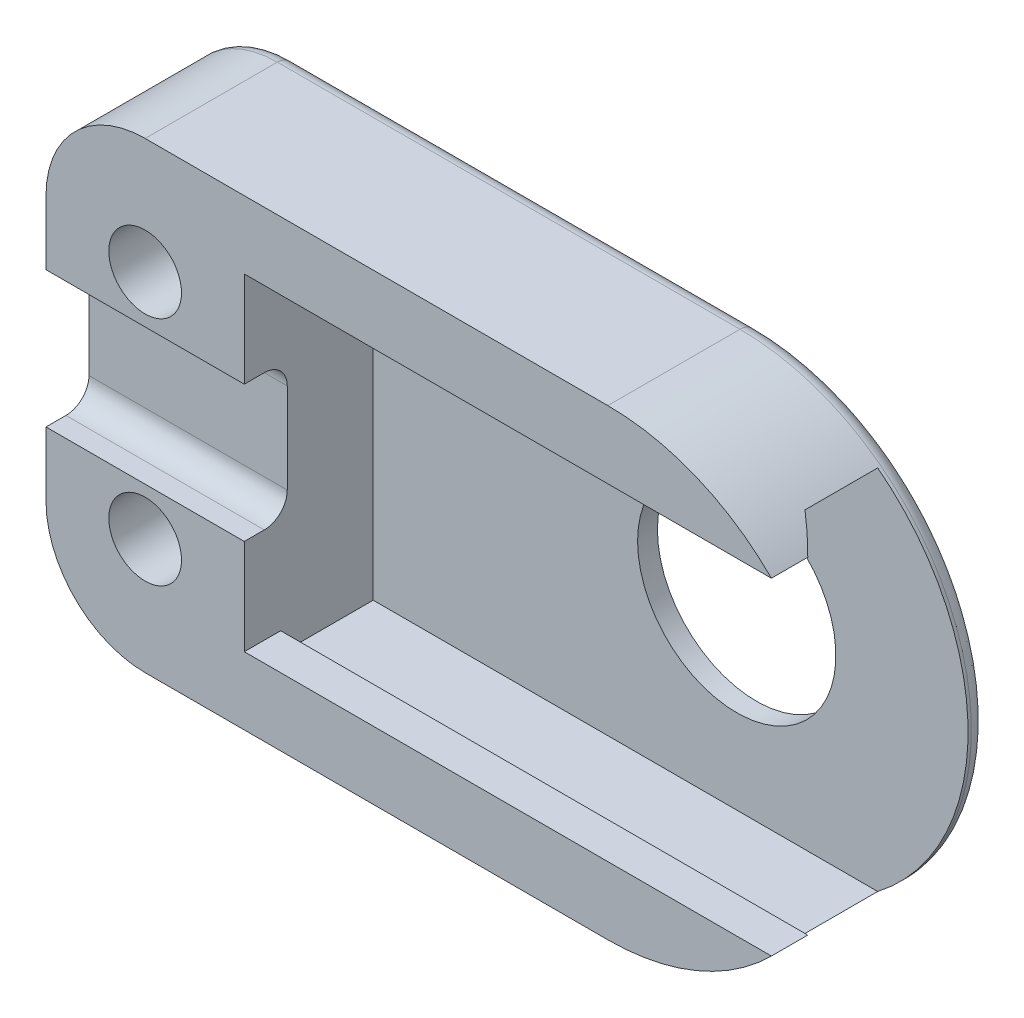
ISO-10303-21;
HEADER;
FILE_DESCRIPTION(('STEP AP214'),'2;1');
FILE_NAME('part.step','',(''),(''),'','','');
FILE_SCHEMA(('AUTOMOTIVE_DESIGN { 1 0 10303 214 1 1 1 1 }'));
ENDSEC;
DATA;
#1=APPLICATION_CONTEXT('core data for automotive mechanical design processes');
#2=APPLICATION_PROTOCOL_DEFINITION('international standard','automotive_design',2000,#1);
#3=PRODUCT_CONTEXT('',#1,'mechanical');
#4=PRODUCT('Part','Part','',(#3));
#5=PRODUCT_RELATED_PRODUCT_CATEGORY('part','',(#4));
#6=PRODUCT_DEFINITION_FORMATION('','',#4);
#7=PRODUCT_DEFINITION_CONTEXT('part definition',#1,'design');
#8=PRODUCT_DEFINITION('design','',#6,#7);
#9=PRODUCT_DEFINITION_SHAPE('','',#8);
#10=(LENGTH_UNIT() NAMED_UNIT(*) SI_UNIT(.MILLI.,.METRE.));
#11=(NAMED_UNIT(*) PLANE_ANGLE_UNIT() SI_UNIT($,.RADIAN.));
#12=(NAMED_UNIT(*) SI_UNIT($,.STERADIAN.) SOLID_ANGLE_UNIT());
#13=UNCERTAINTY_MEASURE_WITH_UNIT(LENGTH_MEASURE(1.E-05),#10,'distance_accuracy_value','');
#14=(GEOMETRIC_REPRESENTATION_CONTEXT(3) GLOBAL_UNCERTAINTY_ASSIGNED_CONTEXT((#13)) GLOBAL_UNIT_ASSIGNED_CONTEXT((#10,
#11,#12)) REPRESENTATION_CONTEXT('',''));
#15=CARTESIAN_POINT('',(0.,0.,0.));
#16=DIRECTION('',(0.,0.,1.));
#17=DIRECTION('',(1.,0.,0.));
#18=AXIS2_PLACEMENT_3D('',#15,#16,#17);
#19=CARTESIAN_POINT('',(0.,0.,4.5));
#20=DIRECTION('',(0.,0.,-1.));
#21=DIRECTION('',(-1.,0.,0.));
#22=AXIS2_PLACEMENT_3D('',#19,#20,#21);
#23=PLANE('',#22);
#24=CARTESIAN_POINT('',(-14.,3.5,4.5));
#25=DIRECTION('',(0.,0.,1.));
#26=DIRECTION('',(1.,0.,0.));
#27=AXIS2_PLACEMENT_3D('',#24,#25,#26);
#28=CIRCLE('',#27,1.1);
#29=CARTESIAN_POINT('',(-12.9,3.5,4.5));
#30=VERTEX_POINT('',#29);
#31=EDGE_CURVE('E284',#30,#30,#28,.T.);
#32=ORIENTED_EDGE('',*,*,#31,.F.);
#33=EDGE_LOOP('',(#32));
#34=FACE_BOUND('',#33,.T.);
#35=DIRECTION('',(-1.,0.,0.));
#36=VECTOR('',#35,1.);
#37=CARTESIAN_POINT('',(-17.,7.,4.5));
#38=LINE('',#37,#36);
#39=CARTESIAN_POINT('',(0.,7.,4.5));
#40=VERTEX_POINT('',#39);
#41=CARTESIAN_POINT('',(-14.,7.,4.5));
#42=VERTEX_POINT('',#41);
#43=EDGE_CURVE('E291',#40,#42,#38,.T.);
#44=ORIENTED_EDGE('',*,*,#43,.T.);
#45=CARTESIAN_POINT('',(-14.,4.,4.5));
#46=DIRECTION('',(0.,0.,-1.));
#47=DIRECTION('',(-1.,0.,0.));
#48=AXIS2_PLACEMENT_3D('',#45,#46,#47);
#49=CIRCLE('',#48,3.);
#50=CARTESIAN_POINT('',(-17.,4.,4.5));
#51=VERTEX_POINT('',#50);
#52=EDGE_CURVE('E340',#42,#51,#49,.F.);
#53=ORIENTED_EDGE('',*,*,#52,.T.);
#54=DIRECTION('',(0.,-1.,0.));
#55=VECTOR('',#54,1.);
#56=CARTESIAN_POINT('',(-17.,7.,4.5));
#57=LINE('',#56,#55);
#58=CARTESIAN_POINT('',(-17.,2.06,4.5));
#59=VERTEX_POINT('',#58);
#60=EDGE_CURVE('E295',#51,#59,#57,.T.);
#61=ORIENTED_EDGE('',*,*,#60,.T.);
#62=DIRECTION('',(-1.,0.,0.));
#63=VECTOR('',#62,1.);
#64=CARTESIAN_POINT('',(7.,2.06,4.5));
#65=LINE('',#64,#63);
#66=CARTESIAN_POINT('',(-11.,2.06,4.5));
#67=VERTEX_POINT('',#66);
#68=EDGE_CURVE('E207',#67,#59,#65,.T.);
#69=ORIENTED_EDGE('',*,*,#68,.F.);
#70=DIRECTION('',(0.,1.,0.));
#71=VECTOR('',#70,1.);
#72=CARTESIAN_POINT('',(-11.,0.,4.5));
#73=LINE('',#72,#71);
#74=CARTESIAN_POINT('',(-11.,4.95,4.5));
#75=VERTEX_POINT('',#74);
#76=EDGE_CURVE('E244',#67,#75,#73,.T.);
#77=ORIENTED_EDGE('',*,*,#76,.T.);
#78=DIRECTION('',(-1.,0.,0.));
#79=VECTOR('',#78,1.);
#80=CARTESIAN_POINT('',(7.,4.95,4.5));
#81=LINE('',#80,#79);
#82=CARTESIAN_POINT('',(4.94949492372707,4.95,4.5));
#83=VERTEX_POINT('',#82);
#84=EDGE_CURVE('E265',#83,#75,#81,.T.);
#85=ORIENTED_EDGE('',*,*,#84,.F.);
#86=CARTESIAN_POINT('',(0.,0.,4.5));
#87=DIRECTION('',(0.,0.,1.));
#88=DIRECTION('',(-1.,0.,0.));
#89=AXIS2_PLACEMENT_3D('',#86,#87,#88);
#90=CIRCLE('',#89,7.);
#91=EDGE_CURVE('E287',#83,#40,#90,.T.);
#92=ORIENTED_EDGE('',*,*,#91,.T.);
#93=EDGE_LOOP('',(#44,#53,#61,#69,#77,#85,#92));
#94=FACE_BOUND('',#93,.T.);
#95=ADVANCED_FACE('F33',(#34,#94),#23,.F.);
#96=CARTESIAN_POINT('',(-14.,-3.5,4.5));
#97=DIRECTION('',(0.,0.,1.));
#98=DIRECTION('',(-1.,0.,0.));
#99=AXIS2_PLACEMENT_3D('',#96,#97,#98);
#100=CIRCLE('',#99,1.1);
#101=CARTESIAN_POINT('',(-15.1,-3.5,4.5));
#102=VERTEX_POINT('',#101);
#103=EDGE_CURVE('E281',#102,#102,#100,.T.);
#104=ORIENTED_EDGE('',*,*,#103,.F.);
#105=EDGE_LOOP('',(#104));
#106=FACE_BOUND('',#105,.T.);
#107=CARTESIAN_POINT('',(-17.,-2.06,4.5));
#108=VERTEX_POINT('',#107);
#109=CARTESIAN_POINT('',(-17.,-4.,4.5));
#110=VERTEX_POINT('',#109);
#111=EDGE_CURVE('E294',#108,#110,#57,.T.);
#112=ORIENTED_EDGE('',*,*,#111,.T.);
#113=CARTESIAN_POINT('',(-14.,-4.,4.5));
#114=DIRECTION('',(0.,0.,-1.));
#115=DIRECTION('',(-1.,0.,0.));
#116=AXIS2_PLACEMENT_3D('',#113,#114,#115);
#117=CIRCLE('',#116,3.);
#118=CARTESIAN_POINT('',(-14.,-7.,4.5));
#119=VERTEX_POINT('',#118);
#120=EDGE_CURVE('E344',#110,#119,#117,.F.);
#121=ORIENTED_EDGE('',*,*,#120,.T.);
#122=DIRECTION('',(1.,0.,0.));
#123=VECTOR('',#122,1.);
#124=CARTESIAN_POINT('',(-17.,-7.,4.5));
#125=LINE('',#124,#123);
#126=CARTESIAN_POINT('',(0.,-7.,4.5));
#127=VERTEX_POINT('',#126);
#128=EDGE_CURVE('E297',#119,#127,#125,.T.);
#129=ORIENTED_EDGE('',*,*,#128,.T.);
#130=CARTESIAN_POINT('',(4.94949492372707,-4.95,4.5));
#131=VERTEX_POINT('',#130);
#132=EDGE_CURVE('E288',#127,#131,#90,.T.);
#133=ORIENTED_EDGE('',*,*,#132,.T.);
#134=DIRECTION('',(-1.,0.,0.));
#135=VECTOR('',#134,1.);
#136=CARTESIAN_POINT('',(7.,-4.95,4.5));
#137=LINE('',#136,#135);
#138=CARTESIAN_POINT('',(-11.,-4.95,4.5));
#139=VERTEX_POINT('',#138);
#140=EDGE_CURVE('E268',#131,#139,#137,.T.);
#141=ORIENTED_EDGE('',*,*,#140,.T.);
#142=CARTESIAN_POINT('',(-11.,-2.06,4.5));
#143=VERTEX_POINT('',#142);
#144=EDGE_CURVE('E245',#139,#143,#73,.T.);
#145=ORIENTED_EDGE('',*,*,#144,.T.);
#146=DIRECTION('',(-1.,0.,0.));
#147=VECTOR('',#146,1.);
#148=CARTESIAN_POINT('',(7.,-2.06,4.5));
#149=LINE('',#148,#147);
#150=EDGE_CURVE('E225',#143,#108,#149,.T.);
#151=ORIENTED_EDGE('',*,*,#150,.T.);
#152=EDGE_LOOP('',(#112,#121,#129,#133,#141,#145,#151));
#153=FACE_BOUND('',#152,.T.);
#154=ADVANCED_FACE('F423',(#106,#153),#23,.F.);
#155=CARTESIAN_POINT('',(0.,0.,0.));
#156=DIRECTION('',(0.,0.,-1.));
#157=DIRECTION('',(-1.,0.,0.));
#158=AXIS2_PLACEMENT_3D('',#155,#156,#157);
#159=PLANE('',#158);
#160=CARTESIAN_POINT('',(-14.,3.5,0.));
#161=DIRECTION('',(0.,0.,1.));
#162=DIRECTION('',(1.,0.,0.));
#163=AXIS2_PLACEMENT_3D('',#160,#161,#162);
#164=CIRCLE('',#163,1.75);
#165=CARTESIAN_POINT('',(-12.25,3.5,0.));
#166=VERTEX_POINT('',#165);
#167=EDGE_CURVE('E390',#166,#166,#164,.T.);
#168=ORIENTED_EDGE('',*,*,#167,.T.);
#169=EDGE_LOOP('',(#168));
#170=FACE_BOUND('',#169,.T.);
#171=CARTESIAN_POINT('',(-14.,-3.5,0.));
#172=DIRECTION('',(0.,0.,1.));
#173=DIRECTION('',(1.,0.,0.));
#174=AXIS2_PLACEMENT_3D('',#171,#172,#173);
#175=CIRCLE('',#174,1.75);
#176=CARTESIAN_POINT('',(-12.25,-3.5,0.));
#177=VERTEX_POINT('',#176);
#178=EDGE_CURVE('E399',#177,#177,#175,.T.);
#179=ORIENTED_EDGE('',*,*,#178,.T.);
#180=EDGE_LOOP('',(#179));
#181=FACE_BOUND('',#180,.T.);
#182=DIRECTION('',(0.,-1.,0.));
#183=VECTOR('',#182,1.);
#184=CARTESIAN_POINT('',(-16.5,4.,0.));
#185=LINE('',#184,#183);
#186=CARTESIAN_POINT('',(-16.5,-4.,0.));
#187=VERTEX_POINT('',#186);
#188=CARTESIAN_POINT('',(-16.5,4.,0.));
#189=VERTEX_POINT('',#188);
#190=EDGE_CURVE('E346',#187,#189,#185,.F.);
#191=ORIENTED_EDGE('',*,*,#190,.T.);
#192=CARTESIAN_POINT('',(-14.,4.,0.));
#193=DIRECTION('',(0.,0.,-1.));
#194=DIRECTION('',(-1.,0.,0.));
#195=AXIS2_PLACEMENT_3D('',#192,#193,#194);
#196=CIRCLE('',#195,2.5);
#197=CARTESIAN_POINT('',(-14.,6.5,0.));
#198=VERTEX_POINT('',#197);
#199=EDGE_CURVE('E356',#189,#198,#196,.T.);
#200=ORIENTED_EDGE('',*,*,#199,.T.);
#201=DIRECTION('',(-1.,0.,0.));
#202=VECTOR('',#201,1.);
#203=CARTESIAN_POINT('',(0.,6.5,0.));
#204=LINE('',#203,#202);
#205=CARTESIAN_POINT('',(0.,6.5,0.));
#206=VERTEX_POINT('',#205);
#207=EDGE_CURVE('E354',#198,#206,#204,.F.);
#208=ORIENTED_EDGE('',*,*,#207,.T.);
#209=CARTESIAN_POINT('',(0.,0.,0.));
#210=DIRECTION('',(0.,0.,-1.));
#211=DIRECTION('',(-1.,0.,0.));
#212=AXIS2_PLACEMENT_3D('',#209,#210,#211);
#213=CIRCLE('',#212,6.5);
#214=CARTESIAN_POINT('',(0.,-6.5,0.));
#215=VERTEX_POINT('',#214);
#216=EDGE_CURVE('E352',#206,#215,#213,.T.);
#217=ORIENTED_EDGE('',*,*,#216,.T.);
#218=DIRECTION('',(1.,0.,0.));
#219=VECTOR('',#218,1.);
#220=CARTESIAN_POINT('',(-14.,-6.5,0.));
#221=LINE('',#220,#219);
#222=CARTESIAN_POINT('',(-14.,-6.5,0.));
#223=VERTEX_POINT('',#222);
#224=EDGE_CURVE('E350',#215,#223,#221,.F.);
#225=ORIENTED_EDGE('',*,*,#224,.T.);
#226=CARTESIAN_POINT('',(-14.,-4.,0.));
#227=DIRECTION('',(0.,0.,-1.));
#228=DIRECTION('',(-1.,0.,0.));
#229=AXIS2_PLACEMENT_3D('',#226,#227,#228);
#230=CIRCLE('',#229,2.5);
#231=EDGE_CURVE('E348',#223,#187,#230,.T.);
#232=ORIENTED_EDGE('',*,*,#231,.T.);
#233=EDGE_LOOP('',(#191,#200,#208,#217,#225,#232));
#234=FACE_BOUND('',#233,.T.);
#235=CARTESIAN_POINT('',(0.,0.,0.));
#236=DIRECTION('',(0.,0.,-1.));
#237=DIRECTION('',(-1.,0.,0.));
#238=AXIS2_PLACEMENT_3D('',#235,#236,#237);
#239=CIRCLE('',#238,3.);
#240=CARTESIAN_POINT('',(-3.,0.,0.));
#241=VERTEX_POINT('',#240);
#242=EDGE_CURVE('E278',#241,#241,#239,.T.);
#243=ORIENTED_EDGE('',*,*,#242,.F.);
#244=EDGE_LOOP('',(#243));
#245=FACE_BOUND('',#244,.T.);
#246=ADVANCED_FACE('F403',(#170,#181,#234,#245),#159,.T.);
#247=CARTESIAN_POINT('',(0.,0.,4.5));
#248=DIRECTION('',(0.,0.,-1.));
#249=DIRECTION('',(-1.,0.,0.));
#250=AXIS2_PLACEMENT_3D('',#247,#248,#249);
#251=CYLINDRICAL_SURFACE('',#250,7.);
#252=DIRECTION('',(0.,0.,-1.));
#253=VECTOR('',#252,1.);
#254=CARTESIAN_POINT('',(0.,-7.,4.5));
#255=LINE('',#254,#253);
#256=CARTESIAN_POINT('',(0.,-7.,0.5));
#257=VERTEX_POINT('',#256);
#258=EDGE_CURVE('E299',#127,#257,#255,.T.);
#259=ORIENTED_EDGE('',*,*,#258,.T.);
#260=CARTESIAN_POINT('',(0.,0.,0.5));
#261=DIRECTION('',(0.,0.,-1.));
#262=DIRECTION('',(-1.,0.,0.));
#263=AXIS2_PLACEMENT_3D('',#260,#261,#262);
#264=CIRCLE('',#263,7.);
#265=CARTESIAN_POINT('',(0.,7.,0.5));
#266=VERTEX_POINT('',#265);
#267=EDGE_CURVE('E364',#257,#266,#264,.F.);
#268=ORIENTED_EDGE('',*,*,#267,.T.);
#269=DIRECTION('',(0.,0.,-1.));
#270=VECTOR('',#269,1.);
#271=CARTESIAN_POINT('',(0.,7.,4.5));
#272=LINE('',#271,#270);
#273=EDGE_CURVE('E302',#40,#266,#272,.T.);
#274=ORIENTED_EDGE('',*,*,#273,.F.);
#275=ORIENTED_EDGE('',*,*,#91,.F.);
#276=DIRECTION('',(0.,0.,-1.));
#277=VECTOR('',#276,1.);
#278=CARTESIAN_POINT('',(4.94949492372707,4.95,4.5));
#279=LINE('',#278,#277);
#280=CARTESIAN_POINT('',(4.94949492372707,4.95,3.40000000000002));
#281=VERTEX_POINT('',#280);
#282=EDGE_CURVE('E316',#281,#83,#279,.F.);
#283=ORIENTED_EDGE('',*,*,#282,.F.);
#284=CARTESIAN_POINT('',(0.,0.,8.35000000000015));
#285=DIRECTION('',(0.,-0.707106781186557,-0.707106781186538));
#286=DIRECTION('',(0.,0.707106781186538,-0.707106781186557));
#287=AXIS2_PLACEMENT_3D('',#284,#285,#286);
#288=ELLIPSE('',#287,9.8994949366118,7.);
#289=CARTESIAN_POINT('',(4.26585278695831,5.55,2.8));
#290=VERTEX_POINT('',#289);
#291=EDGE_CURVE('E318',#290,#281,#288,.T.);
#292=ORIENTED_EDGE('',*,*,#291,.F.);
#293=DIRECTION('',(0.,0.,-1.));
#294=VECTOR('',#293,1.);
#295=CARTESIAN_POINT('',(4.26585278695831,5.55,4.5));
#296=LINE('',#295,#294);
#297=CARTESIAN_POINT('',(4.26585278695831,5.55,0.6));
#298=VERTEX_POINT('',#297);
#299=EDGE_CURVE('E320',#298,#290,#296,.F.);
#300=ORIENTED_EDGE('',*,*,#299,.F.);
#301=CARTESIAN_POINT('',(0.,0.,0.6));
#302=DIRECTION('',(0.,0.,-1.));
#303=DIRECTION('',(-1.,0.,0.));
#304=AXIS2_PLACEMENT_3D('',#301,#302,#303);
#305=CIRCLE('',#304,7.);
#306=CARTESIAN_POINT('',(4.26585278695831,-5.55,0.6));
#307=VERTEX_POINT('',#306);
#308=EDGE_CURVE('E276',#298,#307,#305,.T.);
#309=ORIENTED_EDGE('',*,*,#308,.T.);
#310=DIRECTION('',(0.,0.,-1.));
#311=VECTOR('',#310,1.);
#312=CARTESIAN_POINT('',(4.26585278695831,-5.55,4.5));
#313=LINE('',#312,#311);
#314=CARTESIAN_POINT('',(4.26585278695831,-5.55,2.8));
#315=VERTEX_POINT('',#314);
#316=EDGE_CURVE('E305',#307,#315,#313,.F.);
#317=ORIENTED_EDGE('',*,*,#316,.T.);
#318=CARTESIAN_POINT('',(0.,0.,8.35000000000014));
#319=DIRECTION('',(0.,-0.707106781186556,0.707106781186539));
#320=DIRECTION('',(0.,-0.707106781186539,-0.707106781186556));
#321=AXIS2_PLACEMENT_3D('',#318,#319,#320);
#322=ELLIPSE('',#321,9.89949493661178,7.);
#323=CARTESIAN_POINT('',(4.94949492372707,-4.95,3.40000000000002));
#324=VERTEX_POINT('',#323);
#325=EDGE_CURVE('E310',#315,#324,#322,.T.);
#326=ORIENTED_EDGE('',*,*,#325,.T.);
#327=DIRECTION('',(0.,0.,-1.));
#328=VECTOR('',#327,1.);
#329=CARTESIAN_POINT('',(4.94949492372707,-4.95,4.5));
#330=LINE('',#329,#328);
#331=EDGE_CURVE('E313',#324,#131,#330,.F.);
#332=ORIENTED_EDGE('',*,*,#331,.T.);
#333=ORIENTED_EDGE('',*,*,#132,.F.);
#334=EDGE_LOOP('',(#259,#268,#274,#275,#283,#292,#300,#309,#317,#326,#332,#333));
#335=FACE_BOUND('',#334,.T.);
#336=ADVANCED_FACE('F438',(#335),#251,.T.);
#337=CARTESIAN_POINT('',(-17.,7.,4.5));
#338=DIRECTION('',(0.,-1.,0.));
#339=DIRECTION('',(0.,0.,-1.));
#340=AXIS2_PLACEMENT_3D('',#337,#338,#339);
#341=PLANE('',#340);
#342=ORIENTED_EDGE('',*,*,#273,.T.);
#343=DIRECTION('',(-1.,0.,0.));
#344=VECTOR('',#343,1.);
#345=CARTESIAN_POINT('',(-14.,7.,0.5));
#346=LINE('',#345,#344);
#347=CARTESIAN_POINT('',(-14.,7.,0.5));
#348=VERTEX_POINT('',#347);
#349=EDGE_CURVE('E362',#266,#348,#346,.T.);
#350=ORIENTED_EDGE('',*,*,#349,.T.);
#351=DIRECTION('',(0.,0.,-1.));
#352=VECTOR('',#351,1.);
#353=CARTESIAN_POINT('',(-14.,7.,4.5));
#354=LINE('',#353,#352);
#355=EDGE_CURVE('E338',#348,#42,#354,.F.);
#356=ORIENTED_EDGE('',*,*,#355,.T.);
#357=ORIENTED_EDGE('',*,*,#43,.F.);
#358=EDGE_LOOP('',(#342,#350,#356,#357));
#359=FACE_BOUND('',#358,.T.);
#360=ADVANCED_FACE('F446',(#359),#341,.F.);
#361=CARTESIAN_POINT('',(-17.,7.,4.5));
#362=DIRECTION('',(1.,0.,0.));
#363=DIRECTION('',(0.,1.,0.));
#364=AXIS2_PLACEMENT_3D('',#361,#362,#363);
#365=PLANE('',#364);
#366=DIRECTION('',(0.,0.,-1.));
#367=VECTOR('',#366,1.);
#368=CARTESIAN_POINT('',(-17.,4.,4.5));
#369=LINE('',#368,#367);
#370=CARTESIAN_POINT('',(-17.,4.,0.5));
#371=VERTEX_POINT('',#370);
#372=EDGE_CURVE('E336',#51,#371,#369,.T.);
#373=ORIENTED_EDGE('',*,*,#372,.T.);
#374=DIRECTION('',(0.,-1.,0.));
#375=VECTOR('',#374,1.);
#376=CARTESIAN_POINT('',(-17.,-4.,0.5));
#377=LINE('',#376,#375);
#378=CARTESIAN_POINT('',(-17.,-4.,0.5));
#379=VERTEX_POINT('',#378);
#380=EDGE_CURVE('E11',#371,#379,#377,.T.);
#381=ORIENTED_EDGE('',*,*,#380,.T.);
#382=DIRECTION('',(0.,0.,-1.));
#383=VECTOR('',#382,1.);
#384=CARTESIAN_POINT('',(-17.,-4.,4.5));
#385=LINE('',#384,#383);
#386=EDGE_CURVE('E334',#379,#110,#385,.F.);
#387=ORIENTED_EDGE('',*,*,#386,.T.);
#388=ORIENTED_EDGE('',*,*,#111,.F.);
#389=DIRECTION('',(0.,0.,1.));
#390=VECTOR('',#389,1.);
#391=CARTESIAN_POINT('',(-17.,-2.06,4.5));
#392=LINE('',#391,#390);
#393=CARTESIAN_POINT('',(-17.,-2.06,3.89665998448863));
#394=VERTEX_POINT('',#393);
#395=EDGE_CURVE('E200',#394,#108,#392,.T.);
#396=ORIENTED_EDGE('',*,*,#395,.F.);
#397=CARTESIAN_POINT('',(-17.,-1.36334001551137,3.89665998448863));
#398=DIRECTION('',(-1.,0.,0.));
#399=DIRECTION('',(0.,1.,0.));
#400=AXIS2_PLACEMENT_3D('',#397,#398,#399);
#401=CIRCLE('',#400,0.696659984488628);
#402=CARTESIAN_POINT('',(-17.,-1.36334001551138,3.2));
#403=VERTEX_POINT('',#402);
#404=EDGE_CURVE('E216',#403,#394,#401,.T.);
#405=ORIENTED_EDGE('',*,*,#404,.F.);
#406=DIRECTION('',(0.,-1.,0.));
#407=VECTOR('',#406,1.);
#408=CARTESIAN_POINT('',(-17.,1.36334001551137,3.2));
#409=LINE('',#408,#407);
#410=CARTESIAN_POINT('',(-17.,1.36334001551137,3.2));
#411=VERTEX_POINT('',#410);
#412=EDGE_CURVE('E214',#411,#403,#409,.T.);
#413=ORIENTED_EDGE('',*,*,#412,.F.);
#414=CARTESIAN_POINT('',(-17.,1.36334001551137,3.89665998448863));
#415=DIRECTION('',(-1.,0.,0.));
#416=DIRECTION('',(0.,-1.,0.));
#417=AXIS2_PLACEMENT_3D('',#414,#415,#416);
#418=CIRCLE('',#417,0.696659984488627);
#419=CARTESIAN_POINT('',(-17.,2.06,3.89665998448863));
#420=VERTEX_POINT('',#419);
#421=EDGE_CURVE('E193',#420,#411,#418,.T.);
#422=ORIENTED_EDGE('',*,*,#421,.F.);
#423=DIRECTION('',(0.,0.,-1.));
#424=VECTOR('',#423,1.);
#425=CARTESIAN_POINT('',(-17.,2.06,4.5));
#426=LINE('',#425,#424);
#427=EDGE_CURVE('E204',#59,#420,#426,.T.);
#428=ORIENTED_EDGE('',*,*,#427,.F.);
#429=ORIENTED_EDGE('',*,*,#60,.F.);
#430=EDGE_LOOP('',(#373,#381,#387,#388,#396,#405,#413,#422,#428,#429));
#431=FACE_BOUND('',#430,.T.);
#432=ADVANCED_FACE('F211',(#431),#365,.F.);
#433=CARTESIAN_POINT('',(-17.,-7.,4.5));
#434=DIRECTION('',(0.,1.,0.));
#435=DIRECTION('',(0.,0.,1.));
#436=AXIS2_PLACEMENT_3D('',#433,#434,#435);
#437=PLANE('',#436);
#438=DIRECTION('',(0.,0.,-1.));
#439=VECTOR('',#438,1.);
#440=CARTESIAN_POINT('',(-14.,-7.,4.5));
#441=LINE('',#440,#439);
#442=CARTESIAN_POINT('',(-14.,-7.,0.5));
#443=VERTEX_POINT('',#442);
#444=EDGE_CURVE('E342',#119,#443,#441,.T.);
#445=ORIENTED_EDGE('',*,*,#444,.T.);
#446=DIRECTION('',(1.,0.,0.));
#447=VECTOR('',#446,1.);
#448=CARTESIAN_POINT('',(0.,-7.,0.5));
#449=LINE('',#448,#447);
#450=EDGE_CURVE('E366',#443,#257,#449,.T.);
#451=ORIENTED_EDGE('',*,*,#450,.T.);
#452=ORIENTED_EDGE('',*,*,#258,.F.);
#453=ORIENTED_EDGE('',*,*,#128,.F.);
#454=EDGE_LOOP('',(#445,#451,#452,#453));
#455=FACE_BOUND('',#454,.T.);
#456=ADVANCED_FACE('F440',(#455),#437,.F.);
#457=CARTESIAN_POINT('',(-14.,3.5,4.5));
#458=DIRECTION('',(0.,0.,-1.));
#459=DIRECTION('',(-1.,0.,0.));
#460=AXIS2_PLACEMENT_3D('',#457,#458,#459);
#461=CYLINDRICAL_SURFACE('',#460,1.1);
#462=CARTESIAN_POINT('',(-14.,3.5,1.));
#463=DIRECTION('',(0.,0.,1.));
#464=DIRECTION('',(1.,0.,0.));
#465=AXIS2_PLACEMENT_3D('',#462,#463,#464);
#466=CIRCLE('',#465,1.1);
#467=CARTESIAN_POINT('',(-12.9,3.5,1.));
#468=VERTEX_POINT('',#467);
#469=EDGE_CURVE('E37',#468,#468,#466,.T.);
#470=ORIENTED_EDGE('',*,*,#469,.F.);
#471=EDGE_LOOP('',(#470));
#472=FACE_BOUND('',#471,.T.);
#473=ORIENTED_EDGE('',*,*,#31,.T.);
#474=EDGE_LOOP('',(#473));
#475=FACE_BOUND('',#474,.T.);
#476=ADVANCED_FACE('F434',(#472,#475),#461,.F.);
#477=CARTESIAN_POINT('',(-14.,-3.5,4.5));
#478=DIRECTION('',(0.,0.,-1.));
#479=DIRECTION('',(-1.,0.,0.));
#480=AXIS2_PLACEMENT_3D('',#477,#478,#479);
#481=CYLINDRICAL_SURFACE('',#480,1.1);
#482=CARTESIAN_POINT('',(-14.,-3.5,1.));
#483=DIRECTION('',(0.,0.,1.));
#484=DIRECTION('',(1.,0.,0.));
#485=AXIS2_PLACEMENT_3D('',#482,#483,#484);
#486=CIRCLE('',#485,1.1);
#487=CARTESIAN_POINT('',(-12.9,-3.5,1.));
#488=VERTEX_POINT('',#487);
#489=EDGE_CURVE('E383',#488,#488,#486,.T.);
#490=ORIENTED_EDGE('',*,*,#489,.F.);
#491=EDGE_LOOP('',(#490));
#492=FACE_BOUND('',#491,.T.);
#493=ORIENTED_EDGE('',*,*,#103,.T.);
#494=EDGE_LOOP('',(#493));
#495=FACE_BOUND('',#494,.T.);
#496=ADVANCED_FACE('F525',(#492,#495),#481,.F.);
#497=CARTESIAN_POINT('',(0.,0.,10.));
#498=DIRECTION('',(0.,0.,-1.));
#499=DIRECTION('',(-1.,0.,0.));
#500=AXIS2_PLACEMENT_3D('',#497,#498,#499);
#501=CYLINDRICAL_SURFACE('',#500,3.);
#502=CARTESIAN_POINT('',(0.,0.,0.6));
#503=DIRECTION('',(0.,0.,-1.));
#504=DIRECTION('',(-1.,0.,0.));
#505=AXIS2_PLACEMENT_3D('',#502,#503,#504);
#506=CIRCLE('',#505,3.);
#507=CARTESIAN_POINT('',(-3.,0.,0.6));
#508=VERTEX_POINT('',#507);
#509=EDGE_CURVE('E260',#508,#508,#506,.F.);
#510=ORIENTED_EDGE('',*,*,#509,.T.);
#511=EDGE_LOOP('',(#510));
#512=FACE_BOUND('',#511,.T.);
#513=ORIENTED_EDGE('',*,*,#242,.T.);
#514=EDGE_LOOP('',(#513));
#515=FACE_BOUND('',#514,.T.);
#516=ADVANCED_FACE('F522',(#512,#515),#501,.F.);
#517=CARTESIAN_POINT('',(7.,5.55,0.));
#518=DIRECTION('',(0.,-1.,0.));
#519=DIRECTION('',(0.,0.,-1.));
#520=AXIS2_PLACEMENT_3D('',#517,#518,#519);
#521=PLANE('',#520);
#522=ORIENTED_EDGE('',*,*,#299,.T.);
#523=DIRECTION('',(-1.,0.,0.));
#524=VECTOR('',#523,1.);
#525=CARTESIAN_POINT('',(7.,5.55,2.8));
#526=LINE('',#525,#524);
#527=CARTESIAN_POINT('',(-11.,5.55,2.8));
#528=VERTEX_POINT('',#527);
#529=EDGE_CURVE('E261',#290,#528,#526,.T.);
#530=ORIENTED_EDGE('',*,*,#529,.T.);
#531=DIRECTION('',(0.,0.,1.));
#532=VECTOR('',#531,1.);
#533=CARTESIAN_POINT('',(-11.,5.55,0.));
#534=LINE('',#533,#532);
#535=CARTESIAN_POINT('',(-11.,5.55,0.6));
#536=VERTEX_POINT('',#535);
#537=EDGE_CURVE('E254',#536,#528,#534,.T.);
#538=ORIENTED_EDGE('',*,*,#537,.F.);
#539=DIRECTION('',(-1.,0.,0.));
#540=VECTOR('',#539,1.);
#541=CARTESIAN_POINT('',(7.,5.55,0.6));
#542=LINE('',#541,#540);
#543=EDGE_CURVE('E258',#298,#536,#542,.T.);
#544=ORIENTED_EDGE('',*,*,#543,.F.);
#545=EDGE_LOOP('',(#522,#530,#538,#544));
#546=FACE_BOUND('',#545,.T.);
#547=ADVANCED_FACE('F524',(#546),#521,.T.);
#548=CARTESIAN_POINT('',(7.,4.17500000000008,4.17499999999996));
#549=DIRECTION('',(0.,-0.707106781186557,-0.707106781186538));
#550=DIRECTION('',(0.,0.707106781186538,-0.707106781186557));
#551=AXIS2_PLACEMENT_3D('',#548,#549,#550);
#552=PLANE('',#551);
#553=ORIENTED_EDGE('',*,*,#291,.T.);
#554=DIRECTION('',(-1.,0.,0.));
#555=VECTOR('',#554,1.);
#556=CARTESIAN_POINT('',(7.,4.95,3.40000000000002));
#557=LINE('',#556,#555);
#558=CARTESIAN_POINT('',(-11.,4.95,3.40000000000002));
#559=VERTEX_POINT('',#558);
#560=EDGE_CURVE('E263',#281,#559,#557,.T.);
#561=ORIENTED_EDGE('',*,*,#560,.T.);
#562=DIRECTION('',(0.,-0.707106781186538,0.707106781186557));
#563=VECTOR('',#562,1.);
#564=CARTESIAN_POINT('',(-11.,4.17500000000007,4.17499999999996));
#565=LINE('',#564,#563);
#566=EDGE_CURVE('E251',#528,#559,#565,.T.);
#567=ORIENTED_EDGE('',*,*,#566,.F.);
#568=ORIENTED_EDGE('',*,*,#529,.F.);
#569=EDGE_LOOP('',(#553,#561,#567,#568));
#570=FACE_BOUND('',#569,.T.);
#571=ADVANCED_FACE('F532',(#570),#552,.T.);
#572=CARTESIAN_POINT('',(7.,4.95,0.));
#573=DIRECTION('',(0.,-1.,0.));
#574=DIRECTION('',(1.,0.,0.));
#575=AXIS2_PLACEMENT_3D('',#572,#573,#574);
#576=PLANE('',#575);
#577=ORIENTED_EDGE('',*,*,#282,.T.);
#578=ORIENTED_EDGE('',*,*,#84,.T.);
#579=DIRECTION('',(0.,0.,1.));
#580=VECTOR('',#579,1.);
#581=CARTESIAN_POINT('',(-11.,4.95,0.));
#582=LINE('',#581,#580);
#583=EDGE_CURVE('E248',#559,#75,#582,.T.);
#584=ORIENTED_EDGE('',*,*,#583,.F.);
#585=ORIENTED_EDGE('',*,*,#560,.F.);
#586=EDGE_LOOP('',(#577,#578,#584,#585));
#587=FACE_BOUND('',#586,.T.);
#588=ADVANCED_FACE('F552',(#587),#576,.T.);
#589=CARTESIAN_POINT('',(7.,-4.95,0.));
#590=DIRECTION('',(0.,-1.,0.));
#591=DIRECTION('',(1.,0.,0.));
#592=AXIS2_PLACEMENT_3D('',#589,#590,#591);
#593=PLANE('',#592);
#594=DIRECTION('',(-1.,0.,0.));
#595=VECTOR('',#594,1.);
#596=CARTESIAN_POINT('',(7.,-4.95,3.40000000000002));
#597=LINE('',#596,#595);
#598=CARTESIAN_POINT('',(-11.,-4.95,3.40000000000002));
#599=VERTEX_POINT('',#598);
#600=EDGE_CURVE('E271',#324,#599,#597,.T.);
#601=ORIENTED_EDGE('',*,*,#600,.T.);
#602=DIRECTION('',(0.,0.,1.));
#603=VECTOR('',#602,1.);
#604=CARTESIAN_POINT('',(-11.,-4.95,0.));
#605=LINE('',#604,#603);
#606=EDGE_CURVE('E241',#599,#139,#605,.T.);
#607=ORIENTED_EDGE('',*,*,#606,.T.);
#608=ORIENTED_EDGE('',*,*,#140,.F.);
#609=ORIENTED_EDGE('',*,*,#331,.F.);
#610=EDGE_LOOP('',(#601,#607,#608,#609));
#611=FACE_BOUND('',#610,.T.);
#612=ADVANCED_FACE('F548',(#611),#593,.F.);
#613=CARTESIAN_POINT('',(7.,-4.17500000000007,4.17499999999997));
#614=DIRECTION('',(0.,-0.707106781186556,0.707106781186539));
#615=DIRECTION('',(0.,-0.707106781186539,-0.707106781186556));
#616=AXIS2_PLACEMENT_3D('',#613,#614,#615);
#617=PLANE('',#616);
#618=DIRECTION('',(-1.,0.,0.));
#619=VECTOR('',#618,1.);
#620=CARTESIAN_POINT('',(7.,-5.55,2.8));
#621=LINE('',#620,#619);
#622=CARTESIAN_POINT('',(-11.,-5.55,2.8));
#623=VERTEX_POINT('',#622);
#624=EDGE_CURVE('E273',#315,#623,#621,.T.);
#625=ORIENTED_EDGE('',*,*,#624,.T.);
#626=DIRECTION('',(0.,0.707106781186539,0.707106781186556));
#627=VECTOR('',#626,1.);
#628=CARTESIAN_POINT('',(-11.,-4.17500000000007,4.17499999999997));
#629=LINE('',#628,#627);
#630=EDGE_CURVE('E238',#623,#599,#629,.T.);
#631=ORIENTED_EDGE('',*,*,#630,.T.);
#632=ORIENTED_EDGE('',*,*,#600,.F.);
#633=ORIENTED_EDGE('',*,*,#325,.F.);
#634=EDGE_LOOP('',(#625,#631,#632,#633));
#635=FACE_BOUND('',#634,.T.);
#636=ADVANCED_FACE('F544',(#635),#617,.F.);
#637=CARTESIAN_POINT('',(7.,-5.55,0.));
#638=DIRECTION('',(0.,-1.,0.));
#639=DIRECTION('',(0.,0.,-1.));
#640=AXIS2_PLACEMENT_3D('',#637,#638,#639);
#641=PLANE('',#640);
#642=DIRECTION('',(-1.,0.,0.));
#643=VECTOR('',#642,1.);
#644=CARTESIAN_POINT('',(7.,-5.55,0.6));
#645=LINE('',#644,#643);
#646=CARTESIAN_POINT('',(-11.,-5.55,0.6));
#647=VERTEX_POINT('',#646);
#648=EDGE_CURVE('E257',#307,#647,#645,.T.);
#649=ORIENTED_EDGE('',*,*,#648,.T.);
#650=DIRECTION('',(0.,0.,1.));
#651=VECTOR('',#650,1.);
#652=CARTESIAN_POINT('',(-11.,-5.55,0.));
#653=LINE('',#652,#651);
#654=EDGE_CURVE('E235',#647,#623,#653,.T.);
#655=ORIENTED_EDGE('',*,*,#654,.T.);
#656=ORIENTED_EDGE('',*,*,#624,.F.);
#657=ORIENTED_EDGE('',*,*,#316,.F.);
#658=EDGE_LOOP('',(#649,#655,#656,#657));
#659=FACE_BOUND('',#658,.T.);
#660=ADVANCED_FACE('F540',(#659),#641,.F.);
#661=CARTESIAN_POINT('',(7.,0.,0.6));
#662=DIRECTION('',(0.,0.,-1.));
#663=DIRECTION('',(-1.,0.,0.));
#664=AXIS2_PLACEMENT_3D('',#661,#662,#663);
#665=PLANE('',#664);
#666=ORIENTED_EDGE('',*,*,#509,.F.);
#667=EDGE_LOOP('',(#666));
#668=FACE_BOUND('',#667,.T.);
#669=ORIENTED_EDGE('',*,*,#543,.T.);
#670=DIRECTION('',(0.,-1.,0.));
#671=VECTOR('',#670,1.);
#672=CARTESIAN_POINT('',(-11.,0.,0.6));
#673=LINE('',#672,#671);
#674=EDGE_CURVE('E224',#536,#647,#673,.T.);
#675=ORIENTED_EDGE('',*,*,#674,.T.);
#676=ORIENTED_EDGE('',*,*,#648,.F.);
#677=ORIENTED_EDGE('',*,*,#308,.F.);
#678=EDGE_LOOP('',(#669,#675,#676,#677));
#679=FACE_BOUND('',#678,.T.);
#680=ADVANCED_FACE('F537',(#668,#679),#665,.F.);
#681=CARTESIAN_POINT('',(-11.,0.,0.));
#682=DIRECTION('',(-1.,0.,0.));
#683=DIRECTION('',(0.,0.,1.));
#684=AXIS2_PLACEMENT_3D('',#681,#682,#683);
#685=PLANE('',#684);
#686=ORIENTED_EDGE('',*,*,#76,.F.);
#687=DIRECTION('',(0.,0.,-1.));
#688=VECTOR('',#687,1.);
#689=CARTESIAN_POINT('',(-11.,2.06,0.));
#690=LINE('',#689,#688);
#691=CARTESIAN_POINT('',(-11.,2.06,3.89665998448863));
#692=VERTEX_POINT('',#691);
#693=EDGE_CURVE('E332',#67,#692,#690,.T.);
#694=ORIENTED_EDGE('',*,*,#693,.T.);
#695=CARTESIAN_POINT('',(-11.,1.36334001551137,3.89665998448863));
#696=DIRECTION('',(-1.,0.,0.));
#697=DIRECTION('',(0.,0.,1.));
#698=AXIS2_PLACEMENT_3D('',#695,#696,#697);
#699=CIRCLE('',#698,0.696659984488627);
#700=CARTESIAN_POINT('',(-11.,1.36334001551137,3.2));
#701=VERTEX_POINT('',#700);
#702=EDGE_CURVE('E196',#692,#701,#699,.T.);
#703=ORIENTED_EDGE('',*,*,#702,.T.);
#704=DIRECTION('',(0.,-1.,0.));
#705=VECTOR('',#704,1.);
#706=CARTESIAN_POINT('',(-11.,0.,3.2));
#707=LINE('',#706,#705);
#708=CARTESIAN_POINT('',(-11.,-1.36334001551137,3.2));
#709=VERTEX_POINT('',#708);
#710=EDGE_CURVE('E323',#701,#709,#707,.T.);
#711=ORIENTED_EDGE('',*,*,#710,.T.);
#712=CARTESIAN_POINT('',(-11.,-1.36334001551137,3.89665998448863));
#713=DIRECTION('',(-1.,0.,0.));
#714=DIRECTION('',(0.,0.,1.));
#715=AXIS2_PLACEMENT_3D('',#712,#713,#714);
#716=CIRCLE('',#715,0.696659984488628);
#717=CARTESIAN_POINT('',(-11.,-2.06,3.89665998448863));
#718=VERTEX_POINT('',#717);
#719=EDGE_CURVE('E326',#709,#718,#716,.T.);
#720=ORIENTED_EDGE('',*,*,#719,.T.);
#721=DIRECTION('',(0.,0.,1.));
#722=VECTOR('',#721,1.);
#723=CARTESIAN_POINT('',(-11.,-2.06000000000001,0.));
#724=LINE('',#723,#722);
#725=EDGE_CURVE('E329',#718,#143,#724,.T.);
#726=ORIENTED_EDGE('',*,*,#725,.T.);
#727=ORIENTED_EDGE('',*,*,#144,.F.);
#728=ORIENTED_EDGE('',*,*,#606,.F.);
#729=ORIENTED_EDGE('',*,*,#630,.F.);
#730=ORIENTED_EDGE('',*,*,#654,.F.);
#731=ORIENTED_EDGE('',*,*,#674,.F.);
#732=ORIENTED_EDGE('',*,*,#537,.T.);
#733=ORIENTED_EDGE('',*,*,#566,.T.);
#734=ORIENTED_EDGE('',*,*,#583,.T.);
#735=EDGE_LOOP('',(#686,#694,#703,#711,#720,#726,#727,#728,#729,#730,#731,#732,#733,#734));
#736=FACE_BOUND('',#735,.T.);
#737=ADVANCED_FACE('F498',(#736),#685,.F.);
#738=CARTESIAN_POINT('',(7.,2.06,4.5));
#739=DIRECTION('',(0.,1.,0.));
#740=DIRECTION('',(-1.,0.,0.));
#741=AXIS2_PLACEMENT_3D('',#738,#739,#740);
#742=PLANE('',#741);
#743=ORIENTED_EDGE('',*,*,#68,.T.);
#744=ORIENTED_EDGE('',*,*,#427,.T.);
#745=DIRECTION('',(-1.,0.,0.));
#746=VECTOR('',#745,1.);
#747=CARTESIAN_POINT('',(7.,2.06,3.89665998448863));
#748=LINE('',#747,#746);
#749=EDGE_CURVE('E189',#692,#420,#748,.T.);
#750=ORIENTED_EDGE('',*,*,#749,.F.);
#751=ORIENTED_EDGE('',*,*,#693,.F.);
#752=EDGE_LOOP('',(#743,#744,#750,#751));
#753=FACE_BOUND('',#752,.T.);
#754=ADVANCED_FACE('F205',(#753),#742,.F.);
#755=CARTESIAN_POINT('',(7.,-2.06,4.5));
#756=DIRECTION('',(0.,-1.,0.));
#757=DIRECTION('',(0.,0.,-1.));
#758=AXIS2_PLACEMENT_3D('',#755,#756,#757);
#759=PLANE('',#758);
#760=DIRECTION('',(-1.,0.,0.));
#761=VECTOR('',#760,1.);
#762=CARTESIAN_POINT('',(7.,-2.06,3.89665998448863));
#763=LINE('',#762,#761);
#764=EDGE_CURVE('E228',#718,#394,#763,.T.);
#765=ORIENTED_EDGE('',*,*,#764,.T.);
#766=ORIENTED_EDGE('',*,*,#395,.T.);
#767=ORIENTED_EDGE('',*,*,#150,.F.);
#768=ORIENTED_EDGE('',*,*,#725,.F.);
#769=EDGE_LOOP('',(#765,#766,#767,#768));
#770=FACE_BOUND('',#769,.T.);
#771=ADVANCED_FACE('F494',(#770),#759,.F.);
#772=CARTESIAN_POINT('',(7.,-1.36334001551137,3.89665998448863));
#773=DIRECTION('',(-1.,0.,0.));
#774=DIRECTION('',(0.,-1.,0.));
#775=AXIS2_PLACEMENT_3D('',#772,#773,#774);
#776=CYLINDRICAL_SURFACE('',#775,0.696659984488628);
#777=DIRECTION('',(-1.,0.,0.));
#778=VECTOR('',#777,1.);
#779=CARTESIAN_POINT('',(7.,-1.36334001551137,3.2));
#780=LINE('',#779,#778);
#781=EDGE_CURVE('E230',#709,#403,#780,.T.);
#782=ORIENTED_EDGE('',*,*,#781,.T.);
#783=ORIENTED_EDGE('',*,*,#404,.T.);
#784=ORIENTED_EDGE('',*,*,#764,.F.);
#785=ORIENTED_EDGE('',*,*,#719,.F.);
#786=EDGE_LOOP('',(#782,#783,#784,#785));
#787=FACE_BOUND('',#786,.T.);
#788=ADVANCED_FACE('F503',(#787),#776,.F.);
#789=CARTESIAN_POINT('',(7.,1.36334001551137,3.2));
#790=DIRECTION('',(0.,0.,-1.));
#791=DIRECTION('',(0.,1.,0.));
#792=AXIS2_PLACEMENT_3D('',#789,#790,#791);
#793=PLANE('',#792);
#794=DIRECTION('',(-1.,0.,0.));
#795=VECTOR('',#794,1.);
#796=CARTESIAN_POINT('',(7.,1.36334001551137,3.2));
#797=LINE('',#796,#795);
#798=EDGE_CURVE('E199',#701,#411,#797,.T.);
#799=ORIENTED_EDGE('',*,*,#798,.T.);
#800=ORIENTED_EDGE('',*,*,#412,.T.);
#801=ORIENTED_EDGE('',*,*,#781,.F.);
#802=ORIENTED_EDGE('',*,*,#710,.F.);
#803=EDGE_LOOP('',(#799,#800,#801,#802));
#804=FACE_BOUND('',#803,.T.);
#805=ADVANCED_FACE('F505',(#804),#793,.F.);
#806=CARTESIAN_POINT('',(7.,1.36334001551137,3.89665998448863));
#807=DIRECTION('',(-1.,0.,0.));
#808=DIRECTION('',(0.,-1.,0.));
#809=AXIS2_PLACEMENT_3D('',#806,#807,#808);
#810=CYLINDRICAL_SURFACE('',#809,0.696659984488627);
#811=ORIENTED_EDGE('',*,*,#749,.T.);
#812=ORIENTED_EDGE('',*,*,#421,.T.);
#813=ORIENTED_EDGE('',*,*,#798,.F.);
#814=ORIENTED_EDGE('',*,*,#702,.F.);
#815=EDGE_LOOP('',(#811,#812,#813,#814));
#816=FACE_BOUND('',#815,.T.);
#817=ADVANCED_FACE('F191',(#816),#810,.F.);
#818=CARTESIAN_POINT('',(-14.,4.,4.5));
#819=DIRECTION('',(0.,0.,-1.));
#820=DIRECTION('',(-1.,0.,0.));
#821=AXIS2_PLACEMENT_3D('',#818,#819,#820);
#822=CYLINDRICAL_SURFACE('',#821,3.);
#823=ORIENTED_EDGE('',*,*,#355,.F.);
#824=CARTESIAN_POINT('',(-14.,4.,0.5));
#825=DIRECTION('',(0.,0.,-1.));
#826=DIRECTION('',(-1.,0.,0.));
#827=AXIS2_PLACEMENT_3D('',#824,#825,#826);
#828=CIRCLE('',#827,3.);
#829=EDGE_CURVE('E359',#348,#371,#828,.F.);
#830=ORIENTED_EDGE('',*,*,#829,.T.);
#831=ORIENTED_EDGE('',*,*,#372,.F.);
#832=ORIENTED_EDGE('',*,*,#52,.F.);
#833=EDGE_LOOP('',(#823,#830,#831,#832));
#834=FACE_BOUND('',#833,.T.);
#835=ADVANCED_FACE('F453',(#834),#822,.T.);
#836=CARTESIAN_POINT('',(-14.,-4.,4.5));
#837=DIRECTION('',(0.,0.,-1.));
#838=DIRECTION('',(-1.,0.,0.));
#839=AXIS2_PLACEMENT_3D('',#836,#837,#838);
#840=CYLINDRICAL_SURFACE('',#839,3.);
#841=ORIENTED_EDGE('',*,*,#386,.F.);
#842=CARTESIAN_POINT('',(-14.,-4.,0.5));
#843=DIRECTION('',(0.,0.,-1.));
#844=DIRECTION('',(-1.,0.,0.));
#845=AXIS2_PLACEMENT_3D('',#842,#843,#844);
#846=CIRCLE('',#845,3.);
#847=EDGE_CURVE('E42',#379,#443,#846,.F.);
#848=ORIENTED_EDGE('',*,*,#847,.T.);
#849=ORIENTED_EDGE('',*,*,#444,.F.);
#850=ORIENTED_EDGE('',*,*,#120,.F.);
#851=EDGE_LOOP('',(#841,#848,#849,#850));
#852=FACE_BOUND('',#851,.T.);
#853=ADVANCED_FACE('F456',(#852),#840,.T.);
#854=CARTESIAN_POINT('',(-17.,-6.5,0.5));
#855=DIRECTION('',(-1.,0.,0.));
#856=DIRECTION('',(0.,0.,1.));
#857=AXIS2_PLACEMENT_3D('',#854,#855,#856);
#858=CYLINDRICAL_SURFACE('',#857,0.5);
#859=CARTESIAN_POINT('',(0.,-6.5,0.5));
#860=DIRECTION('',(1.,0.,0.));
#861=DIRECTION('',(0.,0.,-1.));
#862=AXIS2_PLACEMENT_3D('',#859,#860,#861);
#863=CIRCLE('',#862,0.5);
#864=EDGE_CURVE('E379',#257,#215,#863,.T.);
#865=ORIENTED_EDGE('',*,*,#864,.F.);
#866=ORIENTED_EDGE('',*,*,#450,.F.);
#867=CARTESIAN_POINT('',(-14.,-6.5,0.5));
#868=DIRECTION('',(-1.,0.,0.));
#869=DIRECTION('',(0.,0.,1.));
#870=AXIS2_PLACEMENT_3D('',#867,#868,#869);
#871=CIRCLE('',#870,0.5);
#872=EDGE_CURVE('E209',#223,#443,#871,.T.);
#873=ORIENTED_EDGE('',*,*,#872,.F.);
#874=ORIENTED_EDGE('',*,*,#224,.F.);
#875=EDGE_LOOP('',(#865,#866,#873,#874));
#876=FACE_BOUND('',#875,.T.);
#877=ADVANCED_FACE('F35',(#876),#858,.T.);
#878=CARTESIAN_POINT('',(-14.,-4.,0.5));
#879=DIRECTION('',(0.,0.,-1.));
#880=DIRECTION('',(-1.,0.,0.));
#881=AXIS2_PLACEMENT_3D('',#878,#879,#880);
#882=TOROIDAL_SURFACE('',#881,2.5,0.5);
#883=ORIENTED_EDGE('',*,*,#872,.T.);
#884=ORIENTED_EDGE('',*,*,#847,.F.);
#885=CARTESIAN_POINT('',(-16.5,-4.,0.5));
#886=DIRECTION('',(0.,1.,0.));
#887=DIRECTION('',(0.,0.,1.));
#888=AXIS2_PLACEMENT_3D('',#885,#886,#887);
#889=CIRCLE('',#888,0.5);
#890=EDGE_CURVE('E376',#187,#379,#889,.T.);
#891=ORIENTED_EDGE('',*,*,#890,.F.);
#892=ORIENTED_EDGE('',*,*,#231,.F.);
#893=EDGE_LOOP('',(#883,#884,#891,#892));
#894=FACE_BOUND('',#893,.T.);
#895=ADVANCED_FACE('F469',(#894),#882,.T.);
#896=CARTESIAN_POINT('',(0.,0.,0.5));
#897=DIRECTION('',(0.,0.,-1.));
#898=DIRECTION('',(-1.,0.,0.));
#899=AXIS2_PLACEMENT_3D('',#896,#897,#898);
#900=TOROIDAL_SURFACE('',#899,6.5,0.5);
#901=ORIENTED_EDGE('',*,*,#864,.T.);
#902=ORIENTED_EDGE('',*,*,#216,.F.);
#903=CARTESIAN_POINT('',(0.,6.5,0.5));
#904=DIRECTION('',(-1.,0.,0.));
#905=DIRECTION('',(0.,0.,1.));
#906=AXIS2_PLACEMENT_3D('',#903,#904,#905);
#907=CIRCLE('',#906,0.5);
#908=EDGE_CURVE('E373',#266,#206,#907,.T.);
#909=ORIENTED_EDGE('',*,*,#908,.F.);
#910=ORIENTED_EDGE('',*,*,#267,.F.);
#911=EDGE_LOOP('',(#901,#902,#909,#910));
#912=FACE_BOUND('',#911,.T.);
#913=ADVANCED_FACE('F466',(#912),#900,.T.);
#914=CARTESIAN_POINT('',(-16.5,7.,0.5));
#915=DIRECTION('',(0.,1.,0.));
#916=DIRECTION('',(-1.,0.,0.));
#917=AXIS2_PLACEMENT_3D('',#914,#915,#916);
#918=CYLINDRICAL_SURFACE('',#917,0.5);
#919=ORIENTED_EDGE('',*,*,#890,.T.);
#920=ORIENTED_EDGE('',*,*,#380,.F.);
#921=CARTESIAN_POINT('',(-16.5,4.,0.5));
#922=DIRECTION('',(0.,1.,0.));
#923=DIRECTION('',(0.,0.,1.));
#924=AXIS2_PLACEMENT_3D('',#921,#922,#923);
#925=CIRCLE('',#924,0.5);
#926=EDGE_CURVE('E371',#189,#371,#925,.T.);
#927=ORIENTED_EDGE('',*,*,#926,.F.);
#928=ORIENTED_EDGE('',*,*,#190,.F.);
#929=EDGE_LOOP('',(#919,#920,#927,#928));
#930=FACE_BOUND('',#929,.T.);
#931=ADVANCED_FACE('F462',(#930),#918,.T.);
#932=CARTESIAN_POINT('',(-17.,6.5,0.5));
#933=DIRECTION('',(1.,0.,0.));
#934=DIRECTION('',(0.,0.,-1.));
#935=AXIS2_PLACEMENT_3D('',#932,#933,#934);
#936=CYLINDRICAL_SURFACE('',#935,0.5);
#937=ORIENTED_EDGE('',*,*,#908,.T.);
#938=ORIENTED_EDGE('',*,*,#207,.F.);
#939=CARTESIAN_POINT('',(-14.,6.5,0.5));
#940=DIRECTION('',(-1.,0.,0.));
#941=DIRECTION('',(0.,0.,1.));
#942=AXIS2_PLACEMENT_3D('',#939,#940,#941);
#943=CIRCLE('',#942,0.5);
#944=EDGE_CURVE('E369',#348,#198,#943,.T.);
#945=ORIENTED_EDGE('',*,*,#944,.F.);
#946=ORIENTED_EDGE('',*,*,#349,.F.);
#947=EDGE_LOOP('',(#937,#938,#945,#946));
#948=FACE_BOUND('',#947,.T.);
#949=ADVANCED_FACE('F418',(#948),#936,.T.);
#950=CARTESIAN_POINT('',(-14.,4.,0.5));
#951=DIRECTION('',(0.,0.,-1.));
#952=DIRECTION('',(-1.,0.,0.));
#953=AXIS2_PLACEMENT_3D('',#950,#951,#952);
#954=TOROIDAL_SURFACE('',#953,2.5,0.5);
#955=ORIENTED_EDGE('',*,*,#926,.T.);
#956=ORIENTED_EDGE('',*,*,#829,.F.);
#957=ORIENTED_EDGE('',*,*,#944,.T.);
#958=ORIENTED_EDGE('',*,*,#199,.F.);
#959=EDGE_LOOP('',(#955,#956,#957,#958));
#960=FACE_BOUND('',#959,.T.);
#961=ADVANCED_FACE('F409',(#960),#954,.T.);
#962=CARTESIAN_POINT('',(-14.,-3.5,1.));
#963=DIRECTION('',(0.,0.,-1.));
#964=DIRECTION('',(-1.,0.,0.));
#965=AXIS2_PLACEMENT_3D('',#962,#963,#964);
#966=CYLINDRICAL_SURFACE('',#965,1.75);
#967=CARTESIAN_POINT('',(-14.,-3.5,1.));
#968=DIRECTION('',(0.,0.,1.));
#969=DIRECTION('',(1.,0.,0.));
#970=AXIS2_PLACEMENT_3D('',#967,#968,#969);
#971=CIRCLE('',#970,1.75);
#972=CARTESIAN_POINT('',(-12.25,-3.5,1.));
#973=VERTEX_POINT('',#972);
#974=EDGE_CURVE('E395',#973,#973,#971,.T.);
#975=ORIENTED_EDGE('',*,*,#974,.T.);
#976=EDGE_LOOP('',(#975));
#977=FACE_BOUND('',#976,.T.);
#978=ORIENTED_EDGE('',*,*,#178,.F.);
#979=EDGE_LOOP('',(#978));
#980=FACE_BOUND('',#979,.T.);
#981=ADVANCED_FACE('F406',(#977,#980),#966,.F.);
#982=CARTESIAN_POINT('',(-14.,-3.5,1.));
#983=DIRECTION('',(0.,0.,1.));
#984=DIRECTION('',(1.,0.,0.));
#985=AXIS2_PLACEMENT_3D('',#982,#983,#984);
#986=PLANE('',#985);
#987=ORIENTED_EDGE('',*,*,#489,.T.);
#988=EDGE_LOOP('',(#987));
#989=FACE_BOUND('',#988,.T.);
#990=ORIENTED_EDGE('',*,*,#974,.F.);
#991=EDGE_LOOP('',(#990));
#992=FACE_BOUND('',#991,.T.);
#993=ADVANCED_FACE('F408',(#989,#992),#986,.F.);
#994=CARTESIAN_POINT('',(-14.,3.5,1.));
#995=DIRECTION('',(0.,0.,-1.));
#996=DIRECTION('',(-1.,0.,0.));
#997=AXIS2_PLACEMENT_3D('',#994,#995,#996);
#998=CYLINDRICAL_SURFACE('',#997,1.75);
#999=CARTESIAN_POINT('',(-14.,3.5,1.));
#1000=DIRECTION('',(0.,0.,1.));
#1001=DIRECTION('',(1.,0.,0.));
#1002=AXIS2_PLACEMENT_3D('',#999,#1000,#1001);
#1003=CIRCLE('',#1002,1.75);
#1004=CARTESIAN_POINT('',(-12.25,3.5,1.));
#1005=VERTEX_POINT('',#1004);
#1006=EDGE_CURVE('E385',#1005,#1005,#1003,.T.);
#1007=ORIENTED_EDGE('',*,*,#1006,.T.);
#1008=EDGE_LOOP('',(#1007));
#1009=FACE_BOUND('',#1008,.T.);
#1010=ORIENTED_EDGE('',*,*,#167,.F.);
#1011=EDGE_LOOP('',(#1010));
#1012=FACE_BOUND('',#1011,.T.);
#1013=ADVANCED_FACE('F416',(#1009,#1012),#998,.F.);
#1014=CARTESIAN_POINT('',(-14.,3.5,1.));
#1015=DIRECTION('',(0.,0.,1.));
#1016=DIRECTION('',(1.,0.,0.));
#1017=AXIS2_PLACEMENT_3D('',#1014,#1015,#1016);
#1018=PLANE('',#1017);
#1019=ORIENTED_EDGE('',*,*,#469,.T.);
#1020=EDGE_LOOP('',(#1019));
#1021=FACE_BOUND('',#1020,.T.);
#1022=ORIENTED_EDGE('',*,*,#1006,.F.);
#1023=EDGE_LOOP('',(#1022));
#1024=FACE_BOUND('',#1023,.T.);
#1025=ADVANCED_FACE('F669',(#1021,#1024),#1018,.F.);
#1026=CLOSED_SHELL('',(#95,#154,#246,#336,#360,#432,#456,#476,#496,#516,#547,#571,#588,#612,
#636,#660,#680,#737,#754,#771,#788,#805,#817,#835,#853,#877,#895,#913,#931,#949,#961,#981,#993,
#1013,#1025));
#1027=MANIFOLD_SOLID_BREP('B2',#1026);
#1028=ADVANCED_BREP_SHAPE_REPRESENTATION('',(#18,#1027),#14);
#1029=SHAPE_DEFINITION_REPRESENTATION(#9,#1028);
ENDSEC;
END-ISO-10303-21;
